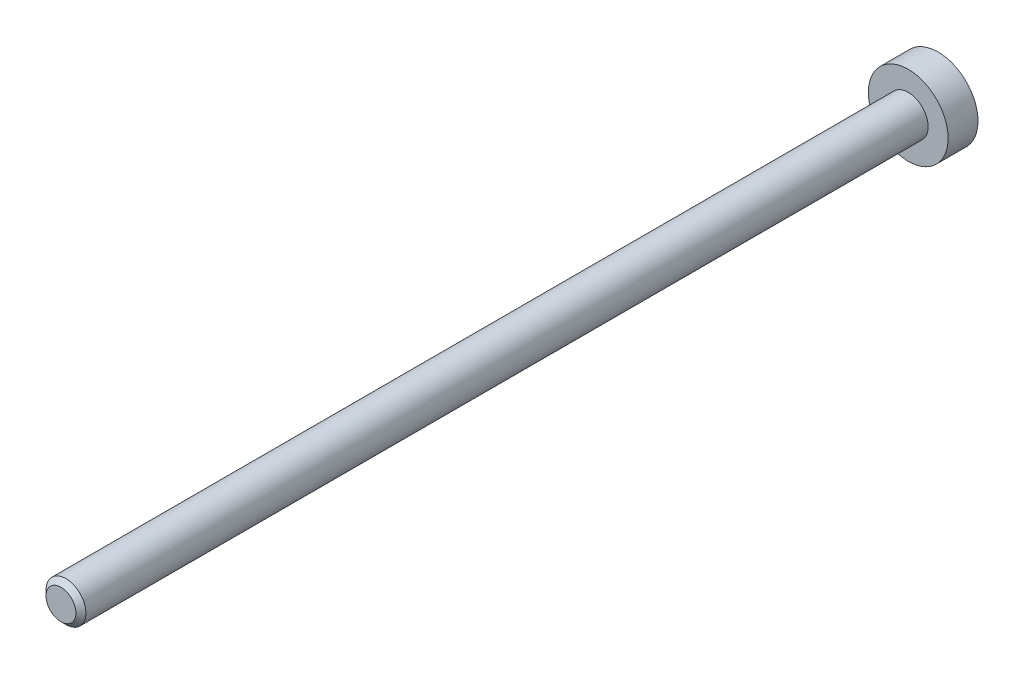
ISO-10303-21;
HEADER;
FILE_DESCRIPTION(('STEP AP214'),'2;1');
FILE_NAME('part.step','',(''),(''),'','','');
FILE_SCHEMA(('AUTOMOTIVE_DESIGN { 1 0 10303 214 1 1 1 1 }'));
ENDSEC;
DATA;
#1=APPLICATION_CONTEXT('core data for automotive mechanical design processes');
#2=APPLICATION_PROTOCOL_DEFINITION('international standard','automotive_design',2000,#1);
#3=PRODUCT_CONTEXT('',#1,'mechanical');
#4=PRODUCT('Part','Part','',(#3));
#5=PRODUCT_RELATED_PRODUCT_CATEGORY('part','',(#4));
#6=PRODUCT_DEFINITION_FORMATION('','',#4);
#7=PRODUCT_DEFINITION_CONTEXT('part definition',#1,'design');
#8=PRODUCT_DEFINITION('design','',#6,#7);
#9=PRODUCT_DEFINITION_SHAPE('','',#8);
#10=(LENGTH_UNIT() NAMED_UNIT(*) SI_UNIT(.MILLI.,.METRE.));
#11=(NAMED_UNIT(*) PLANE_ANGLE_UNIT() SI_UNIT($,.RADIAN.));
#12=(NAMED_UNIT(*) SI_UNIT($,.STERADIAN.) SOLID_ANGLE_UNIT());
#13=UNCERTAINTY_MEASURE_WITH_UNIT(LENGTH_MEASURE(1.E-05),#10,'distance_accuracy_value','');
#14=(GEOMETRIC_REPRESENTATION_CONTEXT(3) GLOBAL_UNCERTAINTY_ASSIGNED_CONTEXT((#13)) GLOBAL_UNIT_ASSIGNED_CONTEXT((#10,
#11,#12)) REPRESENTATION_CONTEXT('',''));
#15=CARTESIAN_POINT('',(0.,0.,0.));
#16=DIRECTION('',(0.,0.,1.));
#17=DIRECTION('',(1.,0.,0.));
#18=AXIS2_PLACEMENT_3D('',#15,#16,#17);
#19=CARTESIAN_POINT('',(0.,0.,3.));
#20=DIRECTION('',(0.,0.,-1.));
#21=DIRECTION('',(-1.,0.,0.));
#22=AXIS2_PLACEMENT_3D('',#19,#20,#21);
#23=CYLINDRICAL_SURFACE('',#22,4.);
#24=CARTESIAN_POINT('',(0.,0.,3.));
#25=DIRECTION('',(0.,0.,1.));
#26=DIRECTION('',(1.,0.,0.));
#27=AXIS2_PLACEMENT_3D('',#24,#25,#26);
#28=CIRCLE('',#27,4.);
#29=CARTESIAN_POINT('',(4.,0.,3.));
#30=VERTEX_POINT('',#29);
#31=EDGE_CURVE('E47',#30,#30,#28,.T.);
#32=ORIENTED_EDGE('',*,*,#31,.F.);
#33=EDGE_LOOP('',(#32));
#34=FACE_BOUND('',#33,.T.);
#35=CARTESIAN_POINT('',(0.,0.,0.));
#36=DIRECTION('',(0.,0.,1.));
#37=DIRECTION('',(1.,0.,0.));
#38=AXIS2_PLACEMENT_3D('',#35,#36,#37);
#39=CIRCLE('',#38,4.);
#40=CARTESIAN_POINT('',(4.,0.,0.));
#41=VERTEX_POINT('',#40);
#42=EDGE_CURVE('E50',#41,#41,#39,.T.);
#43=ORIENTED_EDGE('',*,*,#42,.T.);
#44=EDGE_LOOP('',(#43));
#45=FACE_BOUND('',#44,.T.);
#46=ADVANCED_FACE('F32',(#34,#45),#23,.T.);
#47=CARTESIAN_POINT('',(0.,0.,3.));
#48=DIRECTION('',(0.,0.,1.));
#49=DIRECTION('',(1.,0.,0.));
#50=AXIS2_PLACEMENT_3D('',#47,#48,#49);
#51=PLANE('',#50);
#52=CARTESIAN_POINT('',(0.,0.,3.));
#53=DIRECTION('',(0.,0.,1.));
#54=DIRECTION('',(1.,0.,0.));
#55=AXIS2_PLACEMENT_3D('',#52,#53,#54);
#56=CIRCLE('',#55,2.);
#57=CARTESIAN_POINT('',(2.,0.,3.));
#58=VERTEX_POINT('',#57);
#59=EDGE_CURVE('E43',#58,#58,#56,.T.);
#60=ORIENTED_EDGE('',*,*,#59,.F.);
#61=EDGE_LOOP('',(#60));
#62=FACE_BOUND('',#61,.T.);
#63=ORIENTED_EDGE('',*,*,#31,.T.);
#64=EDGE_LOOP('',(#63));
#65=FACE_BOUND('',#64,.T.);
#66=ADVANCED_FACE('F56',(#62,#65),#51,.T.);
#67=CARTESIAN_POINT('',(0.,0.,0.));
#68=DIRECTION('',(0.,0.,1.));
#69=DIRECTION('',(1.,0.,0.));
#70=AXIS2_PLACEMENT_3D('',#67,#68,#69);
#71=PLANE('',#70);
#72=ORIENTED_EDGE('',*,*,#42,.F.);
#73=EDGE_LOOP('',(#72));
#74=FACE_BOUND('',#73,.T.);
#75=ADVANCED_FACE('F62',(#74),#71,.F.);
#76=CARTESIAN_POINT('',(0.,0.,88.));
#77=DIRECTION('',(0.,0.,-1.));
#78=DIRECTION('',(-1.,0.,0.));
#79=AXIS2_PLACEMENT_3D('',#76,#77,#78);
#80=CYLINDRICAL_SURFACE('',#79,2.);
#81=CARTESIAN_POINT('',(0.,0.,87.5));
#82=DIRECTION('',(0.,0.,1.));
#83=DIRECTION('',(1.,0.,0.));
#84=AXIS2_PLACEMENT_3D('',#81,#82,#83);
#85=CIRCLE('',#84,2.);
#86=CARTESIAN_POINT('',(2.,0.,87.5));
#87=VERTEX_POINT('',#86);
#88=EDGE_CURVE('E10',#87,#87,#85,.F.);
#89=ORIENTED_EDGE('',*,*,#88,.T.);
#90=EDGE_LOOP('',(#89));
#91=FACE_BOUND('',#90,.T.);
#92=ORIENTED_EDGE('',*,*,#59,.T.);
#93=EDGE_LOOP('',(#92));
#94=FACE_BOUND('',#93,.T.);
#95=ADVANCED_FACE('F64',(#91,#94),#80,.T.);
#96=CARTESIAN_POINT('',(0.,0.,88.));
#97=DIRECTION('',(0.,0.,1.));
#98=DIRECTION('',(1.,0.,0.));
#99=AXIS2_PLACEMENT_3D('',#96,#97,#98);
#100=PLANE('',#99);
#101=CARTESIAN_POINT('',(0.,0.,88.));
#102=DIRECTION('',(0.,0.,1.));
#103=DIRECTION('',(1.,0.,0.));
#104=AXIS2_PLACEMENT_3D('',#101,#102,#103);
#105=CIRCLE('',#104,1.5);
#106=CARTESIAN_POINT('',(1.5,0.,88.));
#107=VERTEX_POINT('',#106);
#108=EDGE_CURVE('E39',#107,#107,#105,.T.);
#109=ORIENTED_EDGE('',*,*,#108,.T.);
#110=EDGE_LOOP('',(#109));
#111=FACE_BOUND('',#110,.T.);
#112=ADVANCED_FACE('F70',(#111),#100,.T.);
#113=CARTESIAN_POINT('',(0.,0.,88.));
#114=DIRECTION('',(0.,0.,-1.));
#115=DIRECTION('',(-1.,0.,0.));
#116=AXIS2_PLACEMENT_3D('',#113,#114,#115);
#117=CONICAL_SURFACE('',#116,1.5,0.78539816339746);
#118=ORIENTED_EDGE('',*,*,#88,.F.);
#119=EDGE_LOOP('',(#118));
#120=FACE_BOUND('',#119,.T.);
#121=ORIENTED_EDGE('',*,*,#108,.F.);
#122=EDGE_LOOP('',(#121));
#123=FACE_BOUND('',#122,.T.);
#124=ADVANCED_FACE('F34',(#120,#123),#117,.T.);
#125=CLOSED_SHELL('',(#46,#66,#75,#95,#112,#124));
#126=MANIFOLD_SOLID_BREP('B2',#125);
#127=ADVANCED_BREP_SHAPE_REPRESENTATION('',(#18,#126),#14);
#128=SHAPE_DEFINITION_REPRESENTATION(#9,#127);
ENDSEC;
END-ISO-10303-21;
